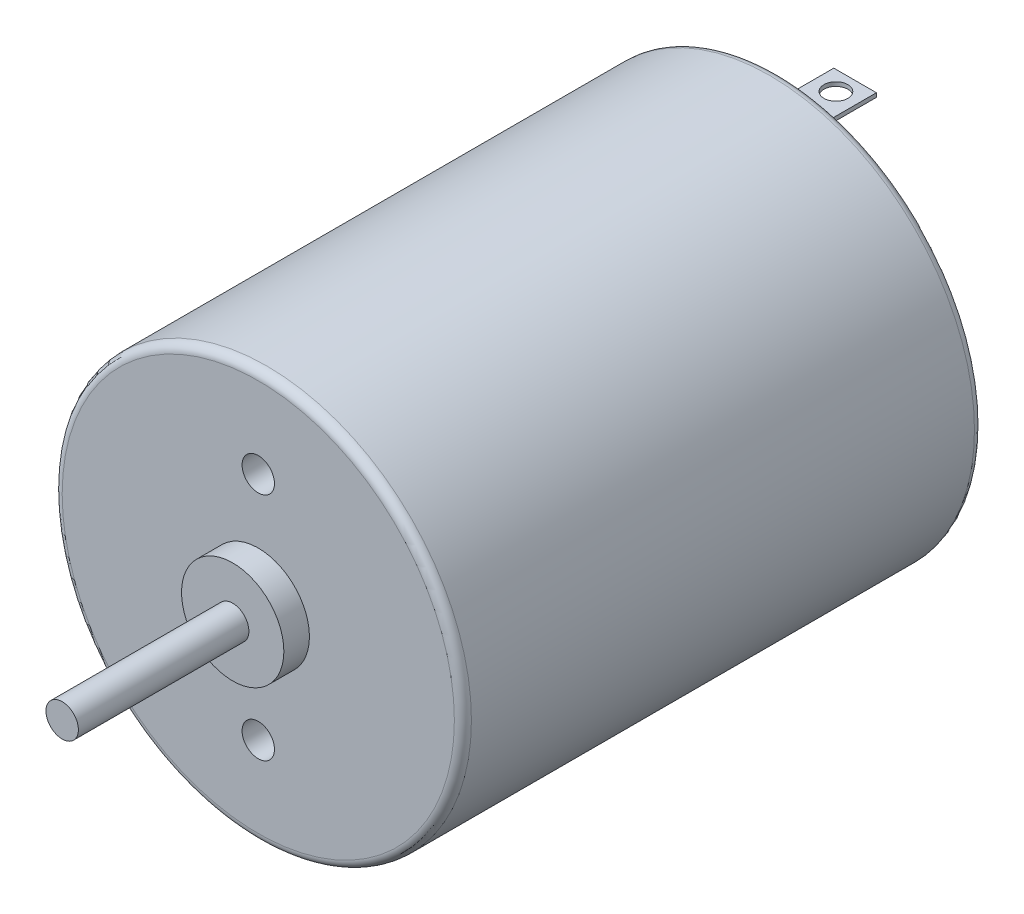
ISO-10303-21;
HEADER;
FILE_DESCRIPTION(('STEP AP214'),'2;1');
FILE_NAME('part.step','',(''),(''),'','','');
FILE_SCHEMA(('AUTOMOTIVE_DESIGN { 1 0 10303 214 1 1 1 1 }'));
ENDSEC;
DATA;
#1=APPLICATION_CONTEXT('core data for automotive mechanical design processes');
#2=APPLICATION_PROTOCOL_DEFINITION('international standard','automotive_design',2000,#1);
#3=PRODUCT_CONTEXT('',#1,'mechanical');
#4=PRODUCT('Part','Part','',(#3));
#5=PRODUCT_RELATED_PRODUCT_CATEGORY('part','',(#4));
#6=PRODUCT_DEFINITION_FORMATION('','',#4);
#7=PRODUCT_DEFINITION_CONTEXT('part definition',#1,'design');
#8=PRODUCT_DEFINITION('design','',#6,#7);
#9=PRODUCT_DEFINITION_SHAPE('','',#8);
#10=(LENGTH_UNIT() NAMED_UNIT(*) SI_UNIT(.MILLI.,.METRE.));
#11=(NAMED_UNIT(*) PLANE_ANGLE_UNIT() SI_UNIT($,.RADIAN.));
#12=(NAMED_UNIT(*) SI_UNIT($,.STERADIAN.) SOLID_ANGLE_UNIT());
#13=UNCERTAINTY_MEASURE_WITH_UNIT(LENGTH_MEASURE(1.E-05),#10,'distance_accuracy_value','');
#14=(GEOMETRIC_REPRESENTATION_CONTEXT(3) GLOBAL_UNCERTAINTY_ASSIGNED_CONTEXT((#13)) GLOBAL_UNIT_ASSIGNED_CONTEXT((#10,
#11,#12)) REPRESENTATION_CONTEXT('',''));
#15=CARTESIAN_POINT('',(0.,0.,0.));
#16=DIRECTION('',(0.,0.,1.));
#17=DIRECTION('',(1.,0.,0.));
#18=AXIS2_PLACEMENT_3D('',#15,#16,#17);
#19=CARTESIAN_POINT('',(0.,0.,30.5));
#20=DIRECTION('',(0.,0.,-1.));
#21=DIRECTION('',(-1.,0.,0.));
#22=AXIS2_PLACEMENT_3D('',#19,#20,#21);
#23=CYLINDRICAL_SURFACE('',#22,12.);
#24=CARTESIAN_POINT('',(0.,0.,0.5));
#25=DIRECTION('',(0.,0.,1.));
#26=DIRECTION('',(1.,0.,0.));
#27=AXIS2_PLACEMENT_3D('',#24,#25,#26);
#28=CIRCLE('',#27,12.);
#29=CARTESIAN_POINT('',(-12.,0.,0.499999999999997));
#30=VERTEX_POINT('',#29);
#31=EDGE_CURVE('E199',#30,#30,#28,.T.);
#32=CARTESIAN_POINT('',(0.,0.,30.));
#33=DIRECTION('',(0.,0.,1.));
#34=DIRECTION('',(1.,0.,0.));
#35=AXIS2_PLACEMENT_3D('',#32,#33,#34);
#36=CIRCLE('',#35,12.);
#37=CARTESIAN_POINT('',(-12.,0.,30.));
#38=VERTEX_POINT('',#37);
#39=EDGE_CURVE('E196',#38,#38,#36,.F.);
#40=CARTESIAN_POINT('',(-12.,0.,0.499999999999997));
#41=CARTESIAN_POINT('',(-12.,0.,0.807291666666663));
#42=CARTESIAN_POINT('',(-12.,0.,1.11458333333333));
#43=CARTESIAN_POINT('',(-12.,0.,1.72916666666666));
#44=CARTESIAN_POINT('',(-12.,0.,2.03645833333333));
#45=CARTESIAN_POINT('',(-12.,0.,2.65104166666666));
#46=CARTESIAN_POINT('',(-12.,0.,2.95833333333333));
#47=CARTESIAN_POINT('',(-12.,0.,3.57291666666666));
#48=CARTESIAN_POINT('',(-12.,0.,3.88020833333333));
#49=CARTESIAN_POINT('',(-12.,0.,4.49479166666666));
#50=CARTESIAN_POINT('',(-12.,0.,4.80208333333333));
#51=CARTESIAN_POINT('',(-12.,0.,5.41666666666666));
#52=CARTESIAN_POINT('',(-12.,0.,5.72395833333333));
#53=CARTESIAN_POINT('',(-12.,0.,6.33854166666667));
#54=CARTESIAN_POINT('',(-12.,0.,6.64583333333333));
#55=CARTESIAN_POINT('',(-12.,0.,7.26041666666666));
#56=CARTESIAN_POINT('',(-12.,0.,7.56770833333333));
#57=CARTESIAN_POINT('',(-12.,0.,8.18229166666666));
#58=CARTESIAN_POINT('',(-12.,0.,8.48958333333333));
#59=CARTESIAN_POINT('',(-12.,0.,9.10416666666666));
#60=CARTESIAN_POINT('',(-12.,0.,9.41145833333333));
#61=CARTESIAN_POINT('',(-12.,0.,10.0260416666667));
#62=CARTESIAN_POINT('',(-12.,0.,10.3333333333333));
#63=CARTESIAN_POINT('',(-12.,0.,10.9479166666667));
#64=CARTESIAN_POINT('',(-12.,0.,11.2552083333333));
#65=CARTESIAN_POINT('',(-12.,0.,11.8697916666667));
#66=CARTESIAN_POINT('',(-12.,0.,12.1770833333333));
#67=CARTESIAN_POINT('',(-12.,0.,12.7916666666667));
#68=CARTESIAN_POINT('',(-12.,0.,13.0989583333333));
#69=CARTESIAN_POINT('',(-12.,0.,13.7135416666667));
#70=CARTESIAN_POINT('',(-12.,0.,14.0208333333333));
#71=CARTESIAN_POINT('',(-12.,0.,14.6354166666667));
#72=CARTESIAN_POINT('',(-12.,0.,14.9427083333333));
#73=CARTESIAN_POINT('',(-12.,0.,15.5572916666667));
#74=CARTESIAN_POINT('',(-12.,0.,15.8645833333333));
#75=CARTESIAN_POINT('',(-12.,0.,16.4791666666667));
#76=CARTESIAN_POINT('',(-12.,0.,16.7864583333333));
#77=CARTESIAN_POINT('',(-12.,0.,17.4010416666667));
#78=CARTESIAN_POINT('',(-12.,0.,17.7083333333333));
#79=CARTESIAN_POINT('',(-12.,0.,18.3229166666667));
#80=CARTESIAN_POINT('',(-12.,0.,18.6302083333333));
#81=CARTESIAN_POINT('',(-12.,0.,19.2447916666667));
#82=CARTESIAN_POINT('',(-12.,0.,19.5520833333333));
#83=CARTESIAN_POINT('',(-12.,0.,20.1666666666667));
#84=CARTESIAN_POINT('',(-12.,0.,20.4739583333333));
#85=CARTESIAN_POINT('',(-12.,0.,21.0885416666667));
#86=CARTESIAN_POINT('',(-12.,0.,21.3958333333333));
#87=CARTESIAN_POINT('',(-12.,0.,22.0104166666667));
#88=CARTESIAN_POINT('',(-12.,0.,22.3177083333333));
#89=CARTESIAN_POINT('',(-12.,0.,22.9322916666667));
#90=CARTESIAN_POINT('',(-12.,0.,23.2395833333333));
#91=CARTESIAN_POINT('',(-12.,0.,23.8541666666667));
#92=CARTESIAN_POINT('',(-12.,0.,24.1614583333333));
#93=CARTESIAN_POINT('',(-12.,0.,24.7760416666667));
#94=CARTESIAN_POINT('',(-12.,0.,25.0833333333333));
#95=CARTESIAN_POINT('',(-12.,0.,25.6979166666667));
#96=CARTESIAN_POINT('',(-12.,0.,26.0052083333333));
#97=CARTESIAN_POINT('',(-12.,0.,26.6197916666667));
#98=CARTESIAN_POINT('',(-12.,0.,26.9270833333333));
#99=CARTESIAN_POINT('',(-12.,0.,27.5416666666667));
#100=CARTESIAN_POINT('',(-12.,0.,27.8489583333333));
#101=CARTESIAN_POINT('',(-12.,0.,28.4635416666667));
#102=CARTESIAN_POINT('',(-12.,0.,28.7708333333333));
#103=CARTESIAN_POINT('',(-12.,0.,29.3854166666667));
#104=CARTESIAN_POINT('',(-12.,0.,29.6927083333333));
#105=CARTESIAN_POINT('',(-12.,0.,30.));
#106=B_SPLINE_CURVE_WITH_KNOTS('',3,(#40,#41,#42,#43,#44,#45,#46,#47,#48,#49,#50,#51,#52,#53,
#54,#55,#56,#57,#58,#59,#60,#61,#62,#63,#64,#65,#66,#67,#68,#69,#70,#71,#72,#73,#74,#75,#76,#77,
#78,#79,#80,#81,#82,#83,#84,#85,#86,#87,#88,#89,#90,#91,#92,#93,#94,#95,#96,#97,#98,#99,#100,
#101,#102,#103,#104,#105),.UNSPECIFIED.,.F.,.F.,(4,2,2,2,2,2,2,2,2,2,2,2,2,2,2,2,2,2,2,2,2,2,2,
2,2,2,2,2,2,2,2,2,4),(0.,0.921874999999999,1.84375,2.765625,3.6875,4.609375,5.53125,6.453125,
7.375,8.296875,9.21875,10.140625,11.0625,11.984375,12.90625,13.828125,14.75,15.671875,16.59375,
17.515625,18.4375,19.359375,20.28125,21.203125,22.125,23.046875,23.96875,24.890625,25.8125,
26.734375,27.65625,28.578125,29.5),.UNSPECIFIED.);
#107=EDGE_CURVE('BSEAM35',#30,#38,#106,.T.);
#108=ORIENTED_EDGE('',*,*,#31,.T.);
#109=ORIENTED_EDGE('',*,*,#39,.T.);
#110=ORIENTED_EDGE('',*,*,#107,.T.);
#111=ORIENTED_EDGE('',*,*,#107,.F.);
#112=EDGE_LOOP('',(#108,#110,#109,#111));
#113=FACE_BOUND('',#112,.T.);
#114=ADVANCED_FACE('F35',(#113),#23,.T.);
#115=CARTESIAN_POINT('',(0.,0.,30.5));
#116=DIRECTION('',(0.,0.,1.));
#117=DIRECTION('',(1.,0.,0.));
#118=AXIS2_PLACEMENT_3D('',#115,#116,#117);
#119=PLANE('',#118);
#120=CARTESIAN_POINT('',(0.,6.75,30.5));
#121=DIRECTION('',(0.,0.,1.));
#122=DIRECTION('',(1.,0.,0.));
#123=AXIS2_PLACEMENT_3D('',#120,#121,#122);
#124=CIRCLE('',#123,0.95);
#125=CARTESIAN_POINT('',(0.95,6.75,30.5));
#126=VERTEX_POINT('',#125);
#127=EDGE_CURVE('E641',#126,#126,#124,.T.);
#128=ORIENTED_EDGE('',*,*,#127,.F.);
#129=EDGE_LOOP('',(#128));
#130=FACE_BOUND('',#129,.T.);
#131=CARTESIAN_POINT('',(0.,-6.75,30.5));
#132=DIRECTION('',(0.,0.,1.));
#133=DIRECTION('',(1.,0.,0.));
#134=AXIS2_PLACEMENT_3D('',#131,#132,#133);
#135=CIRCLE('',#134,0.95);
#136=CARTESIAN_POINT('',(0.95,-6.75,30.5));
#137=VERTEX_POINT('',#136);
#138=EDGE_CURVE('E649',#137,#137,#135,.T.);
#139=ORIENTED_EDGE('',*,*,#138,.F.);
#140=EDGE_LOOP('',(#139));
#141=FACE_BOUND('',#140,.T.);
#142=CARTESIAN_POINT('',(0.,0.,30.5));
#143=DIRECTION('',(0.,0.,1.));
#144=DIRECTION('',(1.,0.,0.));
#145=AXIS2_PLACEMENT_3D('',#142,#143,#144);
#146=CIRCLE('',#145,11.5);
#147=CARTESIAN_POINT('',(11.5,0.,30.5));
#148=VERTEX_POINT('',#147);
#149=EDGE_CURVE('E193',#148,#148,#146,.T.);
#150=ORIENTED_EDGE('',*,*,#149,.T.);
#151=EDGE_LOOP('',(#150));
#152=FACE_BOUND('',#151,.T.);
#153=CARTESIAN_POINT('',(0.,0.,30.5));
#154=DIRECTION('',(0.,0.,1.));
#155=DIRECTION('',(1.,0.,0.));
#156=AXIS2_PLACEMENT_3D('',#153,#154,#155);
#157=CIRCLE('',#156,3.);
#158=CARTESIAN_POINT('',(3.,0.,30.5));
#159=VERTEX_POINT('',#158);
#160=EDGE_CURVE('E182',#159,#159,#157,.T.);
#161=ORIENTED_EDGE('',*,*,#160,.F.);
#162=EDGE_LOOP('',(#161));
#163=FACE_BOUND('',#162,.T.);
#164=ADVANCED_FACE('F294',(#130,#141,#152,#163),#119,.T.);
#165=CARTESIAN_POINT('',(0.,0.,0.));
#166=DIRECTION('',(0.,0.,1.));
#167=DIRECTION('',(1.,0.,0.));
#168=AXIS2_PLACEMENT_3D('',#165,#166,#167);
#169=PLANE('',#168);
#170=CARTESIAN_POINT('',(0.,0.,0.));
#171=DIRECTION('',(0.,0.,1.));
#172=DIRECTION('',(1.,0.,0.));
#173=AXIS2_PLACEMENT_3D('',#170,#171,#172);
#174=CIRCLE('',#173,11.5);
#175=CARTESIAN_POINT('',(11.5,0.,0.));
#176=VERTEX_POINT('',#175);
#177=EDGE_CURVE('E223',#176,#176,#174,.F.);
#178=ORIENTED_EDGE('',*,*,#177,.T.);
#179=EDGE_LOOP('',(#178));
#180=FACE_BOUND('',#179,.T.);
#181=CARTESIAN_POINT('',(0.,0.,0.));
#182=DIRECTION('',(0.,0.,1.));
#183=DIRECTION('',(1.,0.,0.));
#184=AXIS2_PLACEMENT_3D('',#181,#182,#183);
#185=CIRCLE('',#184,5.);
#186=CARTESIAN_POINT('',(5.,0.,0.));
#187=VERTEX_POINT('',#186);
#188=EDGE_CURVE('E220',#187,#187,#185,.T.);
#189=ORIENTED_EDGE('',*,*,#188,.T.);
#190=EDGE_LOOP('',(#189));
#191=FACE_BOUND('',#190,.T.);
#192=DIRECTION('',(-1.,0.,0.));
#193=VECTOR('',#192,1.);
#194=CARTESIAN_POINT('',(0.,-8.51284741519959,0.));
#195=LINE('',#194,#193);
#196=CARTESIAN_POINT('',(1.75,-8.51284741519959,0.));
#197=VERTEX_POINT('',#196);
#198=CARTESIAN_POINT('',(-1.75,-8.5128474151996,0.));
#199=VERTEX_POINT('',#198);
#200=EDGE_CURVE('E215',#197,#199,#195,.T.);
#201=ORIENTED_EDGE('',*,*,#200,.T.);
#202=DIRECTION('',(0.,1.,0.));
#203=VECTOR('',#202,1.);
#204=CARTESIAN_POINT('',(-1.75,-9.25,0.));
#205=LINE('',#204,#203);
#206=CARTESIAN_POINT('',(-1.75,-9.75,0.));
#207=VERTEX_POINT('',#206);
#208=EDGE_CURVE('E217',#199,#207,#205,.F.);
#209=ORIENTED_EDGE('',*,*,#208,.T.);
#210=DIRECTION('',(1.,0.,0.));
#211=VECTOR('',#210,1.);
#212=CARTESIAN_POINT('',(0.,-9.75,0.));
#213=LINE('',#212,#211);
#214=CARTESIAN_POINT('',(1.75,-9.75,0.));
#215=VERTEX_POINT('',#214);
#216=EDGE_CURVE('E211',#207,#215,#213,.T.);
#217=ORIENTED_EDGE('',*,*,#216,.T.);
#218=DIRECTION('',(0.,1.,0.));
#219=VECTOR('',#218,1.);
#220=CARTESIAN_POINT('',(1.74999999999999,0.,0.));
#221=LINE('',#220,#219);
#222=EDGE_CURVE('E213',#215,#197,#221,.T.);
#223=ORIENTED_EDGE('',*,*,#222,.T.);
#224=EDGE_LOOP('',(#201,#209,#217,#223));
#225=FACE_BOUND('',#224,.T.);
#226=DIRECTION('',(-1.,0.,0.));
#227=VECTOR('',#226,1.);
#228=CARTESIAN_POINT('',(1.25,8.51284741519959,0.));
#229=LINE('',#228,#227);
#230=CARTESIAN_POINT('',(-1.75,8.5128474151996,0.));
#231=VERTEX_POINT('',#230);
#232=CARTESIAN_POINT('',(1.75,8.51284741519959,0.));
#233=VERTEX_POINT('',#232);
#234=EDGE_CURVE('E206',#231,#233,#229,.F.);
#235=ORIENTED_EDGE('',*,*,#234,.T.);
#236=DIRECTION('',(0.,-1.,0.));
#237=VECTOR('',#236,1.);
#238=CARTESIAN_POINT('',(1.75,9.25,0.));
#239=LINE('',#238,#237);
#240=CARTESIAN_POINT('',(1.75,9.75,0.));
#241=VERTEX_POINT('',#240);
#242=EDGE_CURVE('E208',#233,#241,#239,.F.);
#243=ORIENTED_EDGE('',*,*,#242,.T.);
#244=DIRECTION('',(-1.,0.,0.));
#245=VECTOR('',#244,1.);
#246=CARTESIAN_POINT('',(0.,9.75,0.));
#247=LINE('',#246,#245);
#248=CARTESIAN_POINT('',(-1.75,9.75,0.));
#249=VERTEX_POINT('',#248);
#250=EDGE_CURVE('E202',#241,#249,#247,.T.);
#251=ORIENTED_EDGE('',*,*,#250,.T.);
#252=DIRECTION('',(0.,-1.,0.));
#253=VECTOR('',#252,1.);
#254=CARTESIAN_POINT('',(-1.75,0.,0.));
#255=LINE('',#254,#253);
#256=EDGE_CURVE('E204',#249,#231,#255,.T.);
#257=ORIENTED_EDGE('',*,*,#256,.T.);
#258=EDGE_LOOP('',(#235,#243,#251,#257));
#259=FACE_BOUND('',#258,.T.);
#260=ADVANCED_FACE('F272',(#180,#191,#225,#259),#169,.F.);
#261=CARTESIAN_POINT('',(0.,0.,-2.));
#262=DIRECTION('',(0.,0.,1.));
#263=DIRECTION('',(1.,0.,0.));
#264=AXIS2_PLACEMENT_3D('',#261,#262,#263);
#265=CYLINDRICAL_SURFACE('',#264,4.5);
#266=CARTESIAN_POINT('',(0.,0.,-0.5));
#267=DIRECTION('',(0.,0.,1.));
#268=DIRECTION('',(1.,0.,0.));
#269=AXIS2_PLACEMENT_3D('',#266,#267,#268);
#270=CIRCLE('',#269,4.5);
#271=CARTESIAN_POINT('',(4.5,0.,-0.5));
#272=VERTEX_POINT('',#271);
#273=EDGE_CURVE('E226',#272,#272,#270,.F.);
#274=ORIENTED_EDGE('',*,*,#273,.T.);
#275=EDGE_LOOP('',(#274));
#276=FACE_BOUND('',#275,.T.);
#277=CARTESIAN_POINT('',(0.,0.,-2.));
#278=DIRECTION('',(0.,0.,-1.));
#279=DIRECTION('',(-1.,0.,0.));
#280=AXIS2_PLACEMENT_3D('',#277,#278,#279);
#281=CIRCLE('',#280,4.5);
#282=CARTESIAN_POINT('',(-4.5,0.,-2.));
#283=VERTEX_POINT('',#282);
#284=EDGE_CURVE('E181',#283,#283,#281,.T.);
#285=ORIENTED_EDGE('',*,*,#284,.F.);
#286=EDGE_LOOP('',(#285));
#287=FACE_BOUND('',#286,.T.);
#288=ADVANCED_FACE('F539',(#276,#287),#265,.T.);
#289=CARTESIAN_POINT('',(0.,0.,-2.));
#290=DIRECTION('',(0.,0.,-1.));
#291=DIRECTION('',(-1.,0.,0.));
#292=AXIS2_PLACEMENT_3D('',#289,#290,#291);
#293=PLANE('',#292);
#294=CARTESIAN_POINT('',(0.,0.,-2.));
#295=DIRECTION('',(0.,0.,-1.));
#296=DIRECTION('',(-1.,0.,0.));
#297=AXIS2_PLACEMENT_3D('',#294,#295,#296);
#298=CIRCLE('',#297,0.95);
#299=CARTESIAN_POINT('',(-0.95,0.,-2.));
#300=VERTEX_POINT('',#299);
#301=EDGE_CURVE('E253',#300,#300,#298,.T.);
#302=ORIENTED_EDGE('',*,*,#301,.F.);
#303=EDGE_LOOP('',(#302));
#304=FACE_BOUND('',#303,.T.);
#305=ORIENTED_EDGE('',*,*,#284,.T.);
#306=EDGE_LOOP('',(#305));
#307=FACE_BOUND('',#306,.T.);
#308=ADVANCED_FACE('F450',(#304,#307),#293,.T.);
#309=CARTESIAN_POINT('',(0.,0.,32.));
#310=DIRECTION('',(0.,0.,-1.));
#311=DIRECTION('',(-1.,0.,0.));
#312=AXIS2_PLACEMENT_3D('',#309,#310,#311);
#313=CYLINDRICAL_SURFACE('',#312,3.);
#314=CARTESIAN_POINT('',(0.,0.,32.));
#315=DIRECTION('',(0.,0.,1.));
#316=DIRECTION('',(1.,0.,0.));
#317=AXIS2_PLACEMENT_3D('',#314,#315,#316);
#318=CIRCLE('',#317,3.);
#319=CARTESIAN_POINT('',(3.,0.,32.));
#320=VERTEX_POINT('',#319);
#321=EDGE_CURVE('E178',#320,#320,#318,.T.);
#322=ORIENTED_EDGE('',*,*,#321,.F.);
#323=EDGE_LOOP('',(#322));
#324=FACE_BOUND('',#323,.T.);
#325=ORIENTED_EDGE('',*,*,#160,.T.);
#326=EDGE_LOOP('',(#325));
#327=FACE_BOUND('',#326,.T.);
#328=ADVANCED_FACE('F445',(#324,#327),#313,.T.);
#329=CARTESIAN_POINT('',(0.,0.,32.));
#330=DIRECTION('',(0.,0.,1.));
#331=DIRECTION('',(1.,0.,0.));
#332=AXIS2_PLACEMENT_3D('',#329,#330,#331);
#333=PLANE('',#332);
#334=CARTESIAN_POINT('',(0.,0.,32.));
#335=DIRECTION('',(0.,0.,1.));
#336=DIRECTION('',(1.,0.,0.));
#337=AXIS2_PLACEMENT_3D('',#334,#335,#336);
#338=CIRCLE('',#337,0.95);
#339=CARTESIAN_POINT('',(0.95,0.,32.));
#340=VERTEX_POINT('',#339);
#341=EDGE_CURVE('E185',#340,#340,#338,.T.);
#342=ORIENTED_EDGE('',*,*,#341,.F.);
#343=EDGE_LOOP('',(#342));
#344=FACE_BOUND('',#343,.T.);
#345=ORIENTED_EDGE('',*,*,#321,.T.);
#346=EDGE_LOOP('',(#345));
#347=FACE_BOUND('',#346,.T.);
#348=ADVANCED_FACE('F449',(#344,#347),#333,.T.);
#349=CARTESIAN_POINT('',(1.24999999999999,0.,-4.5));
#350=DIRECTION('',(1.,0.,0.));
#351=DIRECTION('',(0.,1.,0.));
#352=AXIS2_PLACEMENT_3D('',#349,#350,#351);
#353=PLANE('',#352);
#354=DIRECTION('',(0.,0.,1.));
#355=VECTOR('',#354,1.);
#356=CARTESIAN_POINT('',(1.25,-9.01284741519959,-4.5));
#357=LINE('',#356,#355);
#358=CARTESIAN_POINT('',(1.25,-9.01284741519959,-4.5));
#359=VERTEX_POINT('',#358);
#360=CARTESIAN_POINT('',(1.25,-9.01284741519959,-0.5));
#361=VERTEX_POINT('',#360);
#362=EDGE_CURVE('E166',#359,#361,#357,.T.);
#363=ORIENTED_EDGE('',*,*,#362,.T.);
#364=DIRECTION('',(0.,1.,0.));
#365=VECTOR('',#364,1.);
#366=CARTESIAN_POINT('',(1.24999999999999,0.,-0.5));
#367=LINE('',#366,#365);
#368=CARTESIAN_POINT('',(1.25,-9.25,-0.5));
#369=VERTEX_POINT('',#368);
#370=EDGE_CURVE('E234',#361,#369,#367,.F.);
#371=ORIENTED_EDGE('',*,*,#370,.T.);
#372=DIRECTION('',(0.,0.,1.));
#373=VECTOR('',#372,1.);
#374=CARTESIAN_POINT('',(1.25,-9.25,-4.5));
#375=LINE('',#374,#373);
#376=CARTESIAN_POINT('',(1.25,-9.25,-4.5));
#377=VERTEX_POINT('',#376);
#378=EDGE_CURVE('E175',#377,#369,#375,.T.);
#379=ORIENTED_EDGE('',*,*,#378,.F.);
#380=DIRECTION('',(0.,1.,0.));
#381=VECTOR('',#380,1.);
#382=CARTESIAN_POINT('',(1.24999999999999,0.,-4.5));
#383=LINE('',#382,#381);
#384=EDGE_CURVE('E131',#377,#359,#383,.T.);
#385=ORIENTED_EDGE('',*,*,#384,.T.);
#386=EDGE_LOOP('',(#363,#371,#379,#385));
#387=FACE_BOUND('',#386,.T.);
#388=ADVANCED_FACE('F464',(#387),#353,.T.);
#389=CARTESIAN_POINT('',(0.,-9.25,-4.5));
#390=DIRECTION('',(0.,-1.,0.));
#391=DIRECTION('',(0.,0.,-1.));
#392=AXIS2_PLACEMENT_3D('',#389,#390,#391);
#393=PLANE('',#392);
#394=CARTESIAN_POINT('',(0.,-9.25,-3.375));
#395=DIRECTION('',(0.,-1.,0.));
#396=DIRECTION('',(0.,0.,-1.));
#397=AXIS2_PLACEMENT_3D('',#394,#395,#396);
#398=CIRCLE('',#397,0.7);
#399=CARTESIAN_POINT('',(0.,-9.25,-4.075));
#400=VERTEX_POINT('',#399);
#401=EDGE_CURVE('E140',#400,#400,#398,.T.);
#402=ORIENTED_EDGE('',*,*,#401,.F.);
#403=EDGE_LOOP('',(#402));
#404=FACE_BOUND('',#403,.T.);
#405=ORIENTED_EDGE('',*,*,#378,.T.);
#406=DIRECTION('',(1.,0.,0.));
#407=VECTOR('',#406,1.);
#408=CARTESIAN_POINT('',(0.,-9.25,-0.5));
#409=LINE('',#408,#407);
#410=CARTESIAN_POINT('',(-1.25,-9.25,-0.5));
#411=VERTEX_POINT('',#410);
#412=EDGE_CURVE('E236',#369,#411,#409,.F.);
#413=ORIENTED_EDGE('',*,*,#412,.T.);
#414=DIRECTION('',(0.,0.,1.));
#415=VECTOR('',#414,1.);
#416=CARTESIAN_POINT('',(-1.25,-9.25,-4.5));
#417=LINE('',#416,#415);
#418=CARTESIAN_POINT('',(-1.25,-9.25,-4.5));
#419=VERTEX_POINT('',#418);
#420=EDGE_CURVE('E172',#419,#411,#417,.T.);
#421=ORIENTED_EDGE('',*,*,#420,.F.);
#422=DIRECTION('',(1.,0.,0.));
#423=VECTOR('',#422,1.);
#424=CARTESIAN_POINT('',(0.,-9.25,-4.5));
#425=LINE('',#424,#423);
#426=EDGE_CURVE('E158',#419,#377,#425,.T.);
#427=ORIENTED_EDGE('',*,*,#426,.T.);
#428=EDGE_LOOP('',(#405,#413,#421,#427));
#429=FACE_BOUND('',#428,.T.);
#430=ADVANCED_FACE('F471',(#404,#429),#393,.T.);
#431=CARTESIAN_POINT('',(-1.25,0.,-4.5));
#432=DIRECTION('',(1.,0.,0.));
#433=DIRECTION('',(0.,0.,-1.));
#434=AXIS2_PLACEMENT_3D('',#431,#432,#433);
#435=PLANE('',#434);
#436=ORIENTED_EDGE('',*,*,#420,.T.);
#437=DIRECTION('',(0.,1.,0.));
#438=VECTOR('',#437,1.);
#439=CARTESIAN_POINT('',(-1.25,-9.0128474151996,-0.5));
#440=LINE('',#439,#438);
#441=CARTESIAN_POINT('',(-1.25,-9.0128474151996,-0.5));
#442=VERTEX_POINT('',#441);
#443=EDGE_CURVE('E229',#411,#442,#440,.T.);
#444=ORIENTED_EDGE('',*,*,#443,.T.);
#445=DIRECTION('',(0.,0.,1.));
#446=VECTOR('',#445,1.);
#447=CARTESIAN_POINT('',(-1.25,-9.0128474151996,-4.5));
#448=LINE('',#447,#446);
#449=CARTESIAN_POINT('',(-1.25,-9.0128474151996,-4.5));
#450=VERTEX_POINT('',#449);
#451=EDGE_CURVE('E169',#450,#442,#448,.T.);
#452=ORIENTED_EDGE('',*,*,#451,.F.);
#453=DIRECTION('',(0.,1.,0.));
#454=VECTOR('',#453,1.);
#455=CARTESIAN_POINT('',(-1.25,0.,-4.5));
#456=LINE('',#455,#454);
#457=EDGE_CURVE('E161',#419,#450,#456,.T.);
#458=ORIENTED_EDGE('',*,*,#457,.F.);
#459=EDGE_LOOP('',(#436,#444,#452,#458));
#460=FACE_BOUND('',#459,.T.);
#461=ADVANCED_FACE('F480',(#460),#435,.F.);
#462=CARTESIAN_POINT('',(0.,-9.01284741519959,-4.5));
#463=DIRECTION('',(0.,1.,0.));
#464=DIRECTION('',(-1.,0.,0.));
#465=AXIS2_PLACEMENT_3D('',#462,#463,#464);
#466=PLANE('',#465);
#467=CARTESIAN_POINT('',(0.,-9.01284741519959,-3.375));
#468=DIRECTION('',(0.,1.,0.));
#469=DIRECTION('',(-1.,0.,0.));
#470=AXIS2_PLACEMENT_3D('',#467,#468,#469);
#471=CIRCLE('',#470,0.7);
#472=CARTESIAN_POINT('',(-0.700000000000025,-9.01284741519959,-3.375));
#473=VERTEX_POINT('',#472);
#474=EDGE_CURVE('E191',#473,#473,#471,.T.);
#475=ORIENTED_EDGE('',*,*,#474,.F.);
#476=EDGE_LOOP('',(#475));
#477=FACE_BOUND('',#476,.T.);
#478=ORIENTED_EDGE('',*,*,#451,.T.);
#479=DIRECTION('',(-1.,0.,0.));
#480=VECTOR('',#479,1.);
#481=CARTESIAN_POINT('',(0.,-9.01284741519959,-0.5));
#482=LINE('',#481,#480);
#483=EDGE_CURVE('E232',#442,#361,#482,.F.);
#484=ORIENTED_EDGE('',*,*,#483,.T.);
#485=ORIENTED_EDGE('',*,*,#362,.F.);
#486=DIRECTION('',(-1.,0.,0.));
#487=VECTOR('',#486,1.);
#488=CARTESIAN_POINT('',(0.,-9.01284741519959,-4.5));
#489=LINE('',#488,#487);
#490=EDGE_CURVE('E163',#359,#450,#489,.T.);
#491=ORIENTED_EDGE('',*,*,#490,.T.);
#492=EDGE_LOOP('',(#478,#484,#485,#491));
#493=FACE_BOUND('',#492,.T.);
#494=ADVANCED_FACE('F435',(#477,#493),#466,.T.);
#495=CARTESIAN_POINT('',(0.,0.,-4.5));
#496=DIRECTION('',(0.,0.,-1.));
#497=DIRECTION('',(-1.,0.,0.));
#498=AXIS2_PLACEMENT_3D('',#495,#496,#497);
#499=PLANE('',#498);
#500=ORIENTED_EDGE('',*,*,#384,.F.);
#501=ORIENTED_EDGE('',*,*,#426,.F.);
#502=ORIENTED_EDGE('',*,*,#457,.T.);
#503=ORIENTED_EDGE('',*,*,#490,.F.);
#504=EDGE_LOOP('',(#500,#501,#502,#503));
#505=FACE_BOUND('',#504,.T.);
#506=ADVANCED_FACE('F430',(#505),#499,.T.);
#507=CARTESIAN_POINT('',(-1.25,0.,-4.5));
#508=DIRECTION('',(-1.,0.,0.));
#509=DIRECTION('',(0.,0.,1.));
#510=AXIS2_PLACEMENT_3D('',#507,#508,#509);
#511=PLANE('',#510);
#512=DIRECTION('',(0.,0.,1.));
#513=VECTOR('',#512,1.);
#514=CARTESIAN_POINT('',(-1.25,9.0128474151996,-4.5));
#515=LINE('',#514,#513);
#516=CARTESIAN_POINT('',(-1.25,9.0128474151996,-4.5));
#517=VERTEX_POINT('',#516);
#518=CARTESIAN_POINT('',(-1.25,9.0128474151996,-0.5));
#519=VERTEX_POINT('',#518);
#520=EDGE_CURVE('E151',#517,#519,#515,.T.);
#521=ORIENTED_EDGE('',*,*,#520,.T.);
#522=DIRECTION('',(0.,-1.,0.));
#523=VECTOR('',#522,1.);
#524=CARTESIAN_POINT('',(-1.25,0.,-0.5));
#525=LINE('',#524,#523);
#526=CARTESIAN_POINT('',(-1.25,9.25,-0.5));
#527=VERTEX_POINT('',#526);
#528=EDGE_CURVE('E44',#519,#527,#525,.F.);
#529=ORIENTED_EDGE('',*,*,#528,.T.);
#530=DIRECTION('',(0.,0.,1.));
#531=VECTOR('',#530,1.);
#532=CARTESIAN_POINT('',(-1.25,9.25,-4.5));
#533=LINE('',#532,#531);
#534=CARTESIAN_POINT('',(-1.25,9.25,-4.5));
#535=VERTEX_POINT('',#534);
#536=EDGE_CURVE('E124',#535,#527,#533,.T.);
#537=ORIENTED_EDGE('',*,*,#536,.F.);
#538=DIRECTION('',(0.,-1.,0.));
#539=VECTOR('',#538,1.);
#540=CARTESIAN_POINT('',(-1.25,0.,-4.5));
#541=LINE('',#540,#539);
#542=EDGE_CURVE('E127',#535,#517,#541,.T.);
#543=ORIENTED_EDGE('',*,*,#542,.T.);
#544=EDGE_LOOP('',(#521,#529,#537,#543));
#545=FACE_BOUND('',#544,.T.);
#546=ADVANCED_FACE('F126',(#545),#511,.T.);
#547=CARTESIAN_POINT('',(0.,9.25,-4.5));
#548=DIRECTION('',(0.,1.,0.));
#549=DIRECTION('',(-1.,0.,0.));
#550=AXIS2_PLACEMENT_3D('',#547,#548,#549);
#551=PLANE('',#550);
#552=CARTESIAN_POINT('',(0.,9.25,-3.375));
#553=DIRECTION('',(0.,1.,0.));
#554=DIRECTION('',(-1.,0.,0.));
#555=AXIS2_PLACEMENT_3D('',#552,#553,#554);
#556=CIRCLE('',#555,0.7);
#557=CARTESIAN_POINT('',(-0.7,9.25,-3.375));
#558=VERTEX_POINT('',#557);
#559=EDGE_CURVE('E192',#558,#558,#556,.T.);
#560=ORIENTED_EDGE('',*,*,#559,.F.);
#561=EDGE_LOOP('',(#560));
#562=FACE_BOUND('',#561,.T.);
#563=ORIENTED_EDGE('',*,*,#536,.T.);
#564=DIRECTION('',(-1.,0.,0.));
#565=VECTOR('',#564,1.);
#566=CARTESIAN_POINT('',(0.,9.25,-0.5));
#567=LINE('',#566,#565);
#568=CARTESIAN_POINT('',(1.25,9.25,-0.5));
#569=VERTEX_POINT('',#568);
#570=EDGE_CURVE('E12',#527,#569,#567,.F.);
#571=ORIENTED_EDGE('',*,*,#570,.T.);
#572=DIRECTION('',(0.,0.,1.));
#573=VECTOR('',#572,1.);
#574=CARTESIAN_POINT('',(1.25,9.25,-4.5));
#575=LINE('',#574,#573);
#576=CARTESIAN_POINT('',(1.25,9.25,-4.5));
#577=VERTEX_POINT('',#576);
#578=EDGE_CURVE('E132',#577,#569,#575,.T.);
#579=ORIENTED_EDGE('',*,*,#578,.F.);
#580=DIRECTION('',(-1.,0.,0.));
#581=VECTOR('',#580,1.);
#582=CARTESIAN_POINT('',(0.,9.25,-4.5));
#583=LINE('',#582,#581);
#584=EDGE_CURVE('E137',#577,#535,#583,.T.);
#585=ORIENTED_EDGE('',*,*,#584,.T.);
#586=EDGE_LOOP('',(#563,#571,#579,#585));
#587=FACE_BOUND('',#586,.T.);
#588=ADVANCED_FACE('F142',(#562,#587),#551,.T.);
#589=CARTESIAN_POINT('',(1.24999999999999,0.,-4.5));
#590=DIRECTION('',(-1.,0.,0.));
#591=DIRECTION('',(0.,-1.,0.));
#592=AXIS2_PLACEMENT_3D('',#589,#590,#591);
#593=PLANE('',#592);
#594=ORIENTED_EDGE('',*,*,#578,.T.);
#595=DIRECTION('',(0.,-1.,0.));
#596=VECTOR('',#595,1.);
#597=CARTESIAN_POINT('',(1.25,9.01284741519959,-0.5));
#598=LINE('',#597,#596);
#599=CARTESIAN_POINT('',(1.25,9.01284741519959,-0.5));
#600=VERTEX_POINT('',#599);
#601=EDGE_CURVE('E238',#569,#600,#598,.T.);
#602=ORIENTED_EDGE('',*,*,#601,.T.);
#603=DIRECTION('',(0.,0.,1.));
#604=VECTOR('',#603,1.);
#605=CARTESIAN_POINT('',(1.25,9.01284741519959,-4.5));
#606=LINE('',#605,#604);
#607=CARTESIAN_POINT('',(1.25,9.01284741519959,-4.5));
#608=VERTEX_POINT('',#607);
#609=EDGE_CURVE('E153',#608,#600,#606,.T.);
#610=ORIENTED_EDGE('',*,*,#609,.F.);
#611=DIRECTION('',(0.,-1.,0.));
#612=VECTOR('',#611,1.);
#613=CARTESIAN_POINT('',(1.24999999999999,0.,-4.5));
#614=LINE('',#613,#612);
#615=EDGE_CURVE('E145',#577,#608,#614,.T.);
#616=ORIENTED_EDGE('',*,*,#615,.F.);
#617=EDGE_LOOP('',(#594,#602,#610,#616));
#618=FACE_BOUND('',#617,.T.);
#619=ADVANCED_FACE('F281',(#618),#593,.F.);
#620=CARTESIAN_POINT('',(0.,9.01284741519959,-4.5));
#621=DIRECTION('',(0.,1.,0.));
#622=DIRECTION('',(-1.,0.,0.));
#623=AXIS2_PLACEMENT_3D('',#620,#621,#622);
#624=PLANE('',#623);
#625=CARTESIAN_POINT('',(0.,9.01284741519959,-3.375));
#626=DIRECTION('',(0.,1.,0.));
#627=DIRECTION('',(-1.,0.,0.));
#628=AXIS2_PLACEMENT_3D('',#625,#626,#627);
#629=CIRCLE('',#628,0.7);
#630=CARTESIAN_POINT('',(-0.7,9.0128474151996,-3.375));
#631=VERTEX_POINT('',#630);
#632=EDGE_CURVE('E188',#631,#631,#629,.T.);
#633=ORIENTED_EDGE('',*,*,#632,.T.);
#634=EDGE_LOOP('',(#633));
#635=FACE_BOUND('',#634,.T.);
#636=ORIENTED_EDGE('',*,*,#609,.T.);
#637=DIRECTION('',(-1.,0.,0.));
#638=VECTOR('',#637,1.);
#639=CARTESIAN_POINT('',(-1.25,9.0128474151996,-0.5));
#640=LINE('',#639,#638);
#641=EDGE_CURVE('E59',#600,#519,#640,.T.);
#642=ORIENTED_EDGE('',*,*,#641,.T.);
#643=ORIENTED_EDGE('',*,*,#520,.F.);
#644=DIRECTION('',(-1.,0.,0.));
#645=VECTOR('',#644,1.);
#646=CARTESIAN_POINT('',(0.,9.01284741519959,-4.5));
#647=LINE('',#646,#645);
#648=EDGE_CURVE('E139',#608,#517,#647,.T.);
#649=ORIENTED_EDGE('',*,*,#648,.F.);
#650=EDGE_LOOP('',(#636,#642,#643,#649));
#651=FACE_BOUND('',#650,.T.);
#652=ADVANCED_FACE('F282',(#635,#651),#624,.F.);
#653=CARTESIAN_POINT('',(0.,0.,-4.5));
#654=DIRECTION('',(0.,0.,-1.));
#655=DIRECTION('',(-1.,0.,0.));
#656=AXIS2_PLACEMENT_3D('',#653,#654,#655);
#657=PLANE('',#656);
#658=ORIENTED_EDGE('',*,*,#542,.F.);
#659=ORIENTED_EDGE('',*,*,#584,.F.);
#660=ORIENTED_EDGE('',*,*,#615,.T.);
#661=ORIENTED_EDGE('',*,*,#648,.T.);
#662=EDGE_LOOP('',(#658,#659,#660,#661));
#663=FACE_BOUND('',#662,.T.);
#664=ADVANCED_FACE('F136',(#663),#657,.T.);
#665=CARTESIAN_POINT('',(0.,-20.25,-3.375));
#666=DIRECTION('',(0.,1.,0.));
#667=DIRECTION('',(-1.,0.,0.));
#668=AXIS2_PLACEMENT_3D('',#665,#666,#667);
#669=CYLINDRICAL_SURFACE('',#668,0.7);
#670=ORIENTED_EDGE('',*,*,#559,.T.);
#671=EDGE_LOOP('',(#670));
#672=FACE_BOUND('',#671,.T.);
#673=ORIENTED_EDGE('',*,*,#632,.F.);
#674=EDGE_LOOP('',(#673));
#675=FACE_BOUND('',#674,.T.);
#676=ADVANCED_FACE('F290',(#672,#675),#669,.F.);
#677=ORIENTED_EDGE('',*,*,#401,.T.);
#678=EDGE_LOOP('',(#677));
#679=FACE_BOUND('',#678,.T.);
#680=ORIENTED_EDGE('',*,*,#474,.T.);
#681=EDGE_LOOP('',(#680));
#682=FACE_BOUND('',#681,.T.);
#683=ADVANCED_FACE('F404',(#679,#682),#669,.F.);
#684=CARTESIAN_POINT('',(0.,0.,42.));
#685=DIRECTION('',(0.,0.,-1.));
#686=DIRECTION('',(-1.,0.,0.));
#687=AXIS2_PLACEMENT_3D('',#684,#685,#686);
#688=CYLINDRICAL_SURFACE('',#687,0.95);
#689=CARTESIAN_POINT('',(0.,0.,42.));
#690=DIRECTION('',(0.,0.,1.));
#691=DIRECTION('',(1.,0.,0.));
#692=AXIS2_PLACEMENT_3D('',#689,#690,#691);
#693=CIRCLE('',#692,0.95);
#694=CARTESIAN_POINT('',(0.95,0.,42.));
#695=VERTEX_POINT('',#694);
#696=EDGE_CURVE('E655',#695,#695,#693,.T.);
#697=ORIENTED_EDGE('',*,*,#696,.F.);
#698=EDGE_LOOP('',(#697));
#699=FACE_BOUND('',#698,.T.);
#700=ORIENTED_EDGE('',*,*,#341,.T.);
#701=EDGE_LOOP('',(#700));
#702=FACE_BOUND('',#701,.T.);
#703=ADVANCED_FACE('F396',(#699,#702),#688,.T.);
#704=CARTESIAN_POINT('',(0.,0.,42.));
#705=DIRECTION('',(0.,0.,1.));
#706=DIRECTION('',(1.,0.,0.));
#707=AXIS2_PLACEMENT_3D('',#704,#705,#706);
#708=PLANE('',#707);
#709=ORIENTED_EDGE('',*,*,#696,.T.);
#710=EDGE_LOOP('',(#709));
#711=FACE_BOUND('',#710,.T.);
#712=ADVANCED_FACE('F387',(#711),#708,.T.);
#713=CARTESIAN_POINT('',(0.,0.,-1.8));
#714=DIRECTION('',(0.,0.,-1.));
#715=DIRECTION('',(-1.,0.,0.));
#716=AXIS2_PLACEMENT_3D('',#713,#714,#715);
#717=CYLINDRICAL_SURFACE('',#716,0.95);
#718=CARTESIAN_POINT('',(0.,0.,-1.8));
#719=DIRECTION('',(0.,0.,-1.));
#720=DIRECTION('',(-1.,0.,0.));
#721=AXIS2_PLACEMENT_3D('',#718,#719,#720);
#722=CIRCLE('',#721,0.95);
#723=CARTESIAN_POINT('',(-0.95,0.,-1.8));
#724=VERTEX_POINT('',#723);
#725=EDGE_CURVE('E652',#724,#724,#722,.T.);
#726=ORIENTED_EDGE('',*,*,#725,.F.);
#727=EDGE_LOOP('',(#726));
#728=FACE_BOUND('',#727,.T.);
#729=ORIENTED_EDGE('',*,*,#301,.T.);
#730=EDGE_LOOP('',(#729));
#731=FACE_BOUND('',#730,.T.);
#732=ADVANCED_FACE('F379',(#728,#731),#717,.F.);
#733=CARTESIAN_POINT('',(0.,0.,-1.8));
#734=DIRECTION('',(0.,0.,-1.));
#735=DIRECTION('',(-1.,0.,0.));
#736=AXIS2_PLACEMENT_3D('',#733,#734,#735);
#737=PLANE('',#736);
#738=ORIENTED_EDGE('',*,*,#725,.T.);
#739=EDGE_LOOP('',(#738));
#740=FACE_BOUND('',#739,.T.);
#741=ADVANCED_FACE('F310',(#740),#737,.T.);
#742=CARTESIAN_POINT('',(0.,0.,30.));
#743=DIRECTION('',(0.,0.,1.));
#744=DIRECTION('',(1.,0.,0.));
#745=AXIS2_PLACEMENT_3D('',#742,#743,#744);
#746=TOROIDAL_SURFACE('',#745,11.5,0.5);
#747=ORIENTED_EDGE('',*,*,#39,.F.);
#748=EDGE_LOOP('',(#747));
#749=FACE_BOUND('',#748,.T.);
#750=ORIENTED_EDGE('',*,*,#149,.F.);
#751=EDGE_LOOP('',(#750));
#752=FACE_BOUND('',#751,.T.);
#753=ADVANCED_FACE('F306',(#749,#752),#746,.T.);
#754=CARTESIAN_POINT('',(0.,0.,0.5));
#755=DIRECTION('',(0.,0.,1.));
#756=DIRECTION('',(1.,0.,0.));
#757=AXIS2_PLACEMENT_3D('',#754,#755,#756);
#758=TOROIDAL_SURFACE('',#757,11.5,0.5);
#759=ORIENTED_EDGE('',*,*,#177,.F.);
#760=EDGE_LOOP('',(#759));
#761=FACE_BOUND('',#760,.T.);
#762=ORIENTED_EDGE('',*,*,#31,.F.);
#763=EDGE_LOOP('',(#762));
#764=FACE_BOUND('',#763,.T.);
#765=ADVANCED_FACE('F309',(#761,#764),#758,.T.);
#766=CARTESIAN_POINT('',(0.,0.,-0.5));
#767=DIRECTION('',(0.,0.,1.));
#768=DIRECTION('',(1.,0.,0.));
#769=AXIS2_PLACEMENT_3D('',#766,#767,#768);
#770=TOROIDAL_SURFACE('',#769,5.,0.5);
#771=ORIENTED_EDGE('',*,*,#188,.F.);
#772=EDGE_LOOP('',(#771));
#773=FACE_BOUND('',#772,.T.);
#774=ORIENTED_EDGE('',*,*,#273,.F.);
#775=EDGE_LOOP('',(#774));
#776=FACE_BOUND('',#775,.T.);
#777=ADVANCED_FACE('F314',(#773,#776),#770,.F.);
#778=CARTESIAN_POINT('',(1.74999999999999,0.,-0.5));
#779=DIRECTION('',(0.,1.,0.));
#780=DIRECTION('',(-1.,0.,0.));
#781=AXIS2_PLACEMENT_3D('',#778,#779,#780);
#782=CYLINDRICAL_SURFACE('',#781,0.5);
#783=CARTESIAN_POINT('',(1.75,-8.51284741519959,-0.5));
#784=DIRECTION('',(-0.707106781186549,0.707106781186546,0.));
#785=DIRECTION('',(0.707106781186546,0.707106781186549,0.));
#786=AXIS2_PLACEMENT_3D('',#783,#784,#785);
#787=ELLIPSE('',#786,0.707106781186548,0.5);
#788=EDGE_CURVE('E247',#197,#361,#787,.F.);
#789=ORIENTED_EDGE('',*,*,#788,.F.);
#790=ORIENTED_EDGE('',*,*,#222,.F.);
#791=CARTESIAN_POINT('',(1.75,-9.75,-0.5));
#792=DIRECTION('',(0.707106781186547,0.707106781186548,0.));
#793=DIRECTION('',(0.707106781186548,-0.707106781186547,0.));
#794=AXIS2_PLACEMENT_3D('',#791,#792,#793);
#795=ELLIPSE('',#794,0.707106781186548,0.5);
#796=EDGE_CURVE('E250',#369,#215,#795,.T.);
#797=ORIENTED_EDGE('',*,*,#796,.F.);
#798=ORIENTED_EDGE('',*,*,#370,.F.);
#799=EDGE_LOOP('',(#789,#790,#797,#798));
#800=FACE_BOUND('',#799,.T.);
#801=ADVANCED_FACE('F318',(#800),#782,.F.);
#802=CARTESIAN_POINT('',(0.,-9.75,-0.5));
#803=DIRECTION('',(1.,0.,0.));
#804=DIRECTION('',(0.,0.,-1.));
#805=AXIS2_PLACEMENT_3D('',#802,#803,#804);
#806=CYLINDRICAL_SURFACE('',#805,0.5);
#807=ORIENTED_EDGE('',*,*,#796,.T.);
#808=ORIENTED_EDGE('',*,*,#216,.F.);
#809=CARTESIAN_POINT('',(-1.75,-9.75,-0.5));
#810=DIRECTION('',(0.707106781186547,-0.707106781186547,0.));
#811=DIRECTION('',(0.707106781186547,0.707106781186547,0.));
#812=AXIS2_PLACEMENT_3D('',#809,#810,#811);
#813=ELLIPSE('',#812,0.707106781186547,0.5);
#814=EDGE_CURVE('E245',#411,#207,#813,.T.);
#815=ORIENTED_EDGE('',*,*,#814,.F.);
#816=ORIENTED_EDGE('',*,*,#412,.F.);
#817=EDGE_LOOP('',(#807,#808,#815,#816));
#818=FACE_BOUND('',#817,.T.);
#819=ADVANCED_FACE('F327',(#818),#806,.F.);
#820=CARTESIAN_POINT('',(0.,-8.51284741519959,-0.5));
#821=DIRECTION('',(-1.,0.,0.));
#822=DIRECTION('',(0.,-1.,0.));
#823=AXIS2_PLACEMENT_3D('',#820,#821,#822);
#824=CYLINDRICAL_SURFACE('',#823,0.5);
#825=ORIENTED_EDGE('',*,*,#788,.T.);
#826=ORIENTED_EDGE('',*,*,#483,.F.);
#827=CARTESIAN_POINT('',(-1.75,-8.5128474151996,-0.5));
#828=DIRECTION('',(-0.707106781186546,-0.707106781186549,0.));
#829=DIRECTION('',(-0.707106781186549,0.707106781186546,0.));
#830=AXIS2_PLACEMENT_3D('',#827,#828,#829);
#831=ELLIPSE('',#830,0.707106781186546,0.5);
#832=EDGE_CURVE('E243',#199,#442,#831,.F.);
#833=ORIENTED_EDGE('',*,*,#832,.F.);
#834=ORIENTED_EDGE('',*,*,#200,.F.);
#835=EDGE_LOOP('',(#825,#826,#833,#834));
#836=FACE_BOUND('',#835,.T.);
#837=ADVANCED_FACE('F323',(#836),#824,.F.);
#838=CARTESIAN_POINT('',(-1.75,0.,-0.5));
#839=DIRECTION('',(0.,-1.,0.));
#840=DIRECTION('',(0.,0.,-1.));
#841=AXIS2_PLACEMENT_3D('',#838,#839,#840);
#842=CYLINDRICAL_SURFACE('',#841,0.5);
#843=ORIENTED_EDGE('',*,*,#814,.T.);
#844=ORIENTED_EDGE('',*,*,#208,.F.);
#845=ORIENTED_EDGE('',*,*,#832,.T.);
#846=ORIENTED_EDGE('',*,*,#443,.F.);
#847=EDGE_LOOP('',(#843,#844,#845,#846));
#848=FACE_BOUND('',#847,.T.);
#849=ADVANCED_FACE('F320',(#848),#842,.F.);
#850=CARTESIAN_POINT('',(-1.75,0.,-0.5));
#851=DIRECTION('',(0.,-1.,0.));
#852=DIRECTION('',(0.,0.,-1.));
#853=AXIS2_PLACEMENT_3D('',#850,#851,#852);
#854=CYLINDRICAL_SURFACE('',#853,0.5);
#855=CARTESIAN_POINT('',(-1.75,8.5128474151996,-0.5));
#856=DIRECTION('',(0.707106781186546,-0.707106781186549,0.));
#857=DIRECTION('',(-0.707106781186549,-0.707106781186546,0.));
#858=AXIS2_PLACEMENT_3D('',#855,#856,#857);
#859=ELLIPSE('',#858,0.707106781186546,0.5);
#860=EDGE_CURVE('E258',#231,#519,#859,.F.);
#861=ORIENTED_EDGE('',*,*,#860,.F.);
#862=ORIENTED_EDGE('',*,*,#256,.F.);
#863=CARTESIAN_POINT('',(-1.75,9.75,-0.5));
#864=DIRECTION('',(-0.707106781186548,-0.707106781186547,0.));
#865=DIRECTION('',(-0.707106781186547,0.707106781186548,0.));
#866=AXIS2_PLACEMENT_3D('',#863,#864,#865);
#867=ELLIPSE('',#866,0.707106781186548,0.5);
#868=EDGE_CURVE('E39',#527,#249,#867,.T.);
#869=ORIENTED_EDGE('',*,*,#868,.F.);
#870=ORIENTED_EDGE('',*,*,#528,.F.);
#871=EDGE_LOOP('',(#861,#862,#869,#870));
#872=FACE_BOUND('',#871,.T.);
#873=ADVANCED_FACE('F37',(#872),#854,.F.);
#874=CARTESIAN_POINT('',(0.,9.75,-0.5));
#875=DIRECTION('',(-1.,0.,0.));
#876=DIRECTION('',(0.,-1.,0.));
#877=AXIS2_PLACEMENT_3D('',#874,#875,#876);
#878=CYLINDRICAL_SURFACE('',#877,0.5);
#879=ORIENTED_EDGE('',*,*,#868,.T.);
#880=ORIENTED_EDGE('',*,*,#250,.F.);
#881=CARTESIAN_POINT('',(1.75,9.75,-0.5));
#882=DIRECTION('',(-0.707106781186547,0.707106781186548,0.));
#883=DIRECTION('',(-0.707106781186548,-0.707106781186547,0.));
#884=AXIS2_PLACEMENT_3D('',#881,#882,#883);
#885=ELLIPSE('',#884,0.707106781186547,0.5);
#886=EDGE_CURVE('E256',#569,#241,#885,.T.);
#887=ORIENTED_EDGE('',*,*,#886,.F.);
#888=ORIENTED_EDGE('',*,*,#570,.F.);
#889=EDGE_LOOP('',(#879,#880,#887,#888));
#890=FACE_BOUND('',#889,.T.);
#891=ADVANCED_FACE('F267',(#890),#878,.F.);
#892=CARTESIAN_POINT('',(0.,8.51284741519959,-0.5));
#893=DIRECTION('',(1.,0.,0.));
#894=DIRECTION('',(0.,1.,0.));
#895=AXIS2_PLACEMENT_3D('',#892,#893,#894);
#896=CYLINDRICAL_SURFACE('',#895,0.5);
#897=ORIENTED_EDGE('',*,*,#860,.T.);
#898=ORIENTED_EDGE('',*,*,#641,.F.);
#899=CARTESIAN_POINT('',(1.75,8.51284741519959,-0.5));
#900=DIRECTION('',(0.707106781186549,0.707106781186546,0.));
#901=DIRECTION('',(0.707106781186546,-0.707106781186549,0.));
#902=AXIS2_PLACEMENT_3D('',#899,#900,#901);
#903=ELLIPSE('',#902,0.707106781186548,0.5);
#904=EDGE_CURVE('E254',#233,#600,#903,.F.);
#905=ORIENTED_EDGE('',*,*,#904,.F.);
#906=ORIENTED_EDGE('',*,*,#234,.F.);
#907=EDGE_LOOP('',(#897,#898,#905,#906));
#908=FACE_BOUND('',#907,.T.);
#909=ADVANCED_FACE('F278',(#908),#896,.F.);
#910=CARTESIAN_POINT('',(1.74999999999999,0.,-0.5));
#911=DIRECTION('',(0.,1.,0.));
#912=DIRECTION('',(-1.,0.,0.));
#913=AXIS2_PLACEMENT_3D('',#910,#911,#912);
#914=CYLINDRICAL_SURFACE('',#913,0.5);
#915=ORIENTED_EDGE('',*,*,#886,.T.);
#916=ORIENTED_EDGE('',*,*,#242,.F.);
#917=ORIENTED_EDGE('',*,*,#904,.T.);
#918=ORIENTED_EDGE('',*,*,#601,.F.);
#919=EDGE_LOOP('',(#915,#916,#917,#918));
#920=FACE_BOUND('',#919,.T.);
#921=ADVANCED_FACE('F276',(#920),#914,.F.);
#922=CARTESIAN_POINT('',(0.,-6.75,10.5));
#923=DIRECTION('',(0.,0.,1.));
#924=DIRECTION('',(1.,0.,0.));
#925=AXIS2_PLACEMENT_3D('',#922,#923,#924);
#926=CYLINDRICAL_SURFACE('',#925,0.95);
#927=CARTESIAN_POINT('',(0.,-6.75,10.5));
#928=DIRECTION('',(0.,0.,1.));
#929=DIRECTION('',(1.,0.,0.));
#930=AXIS2_PLACEMENT_3D('',#927,#928,#929);
#931=CIRCLE('',#930,0.95);
#932=CARTESIAN_POINT('',(0.95,-6.75,10.5));
#933=VERTEX_POINT('',#932);
#934=EDGE_CURVE('E644',#933,#933,#931,.T.);
#935=ORIENTED_EDGE('',*,*,#934,.F.);
#936=EDGE_LOOP('',(#935));
#937=FACE_BOUND('',#936,.T.);
#938=ORIENTED_EDGE('',*,*,#138,.T.);
#939=EDGE_LOOP('',(#938));
#940=FACE_BOUND('',#939,.T.);
#941=ADVANCED_FACE('F337',(#937,#940),#926,.F.);
#942=CARTESIAN_POINT('',(0.,0.,10.5));
#943=DIRECTION('',(0.,0.,1.));
#944=DIRECTION('',(1.,0.,0.));
#945=AXIS2_PLACEMENT_3D('',#942,#943,#944);
#946=PLANE('',#945);
#947=ORIENTED_EDGE('',*,*,#934,.T.);
#948=EDGE_LOOP('',(#947));
#949=FACE_BOUND('',#948,.T.);
#950=ADVANCED_FACE('F594',(#949),#946,.T.);
#951=CARTESIAN_POINT('',(0.,6.75,10.5));
#952=DIRECTION('',(0.,0.,1.));
#953=DIRECTION('',(1.,0.,0.));
#954=AXIS2_PLACEMENT_3D('',#951,#952,#953);
#955=CYLINDRICAL_SURFACE('',#954,0.95);
#956=CARTESIAN_POINT('',(0.,6.75,10.5));
#957=DIRECTION('',(0.,0.,1.));
#958=DIRECTION('',(1.,0.,0.));
#959=AXIS2_PLACEMENT_3D('',#956,#957,#958);
#960=CIRCLE('',#959,0.95);
#961=CARTESIAN_POINT('',(0.95,6.75,10.5));
#962=VERTEX_POINT('',#961);
#963=EDGE_CURVE('E257',#962,#962,#960,.T.);
#964=ORIENTED_EDGE('',*,*,#963,.F.);
#965=EDGE_LOOP('',(#964));
#966=FACE_BOUND('',#965,.T.);
#967=ORIENTED_EDGE('',*,*,#127,.T.);
#968=EDGE_LOOP('',(#967));
#969=FACE_BOUND('',#968,.T.);
#970=ADVANCED_FACE('F605',(#966,#969),#955,.F.);
#971=CARTESIAN_POINT('',(0.,0.,10.5));
#972=DIRECTION('',(0.,0.,1.));
#973=DIRECTION('',(1.,0.,0.));
#974=AXIS2_PLACEMENT_3D('',#971,#972,#973);
#975=PLANE('',#974);
#976=ORIENTED_EDGE('',*,*,#963,.T.);
#977=EDGE_LOOP('',(#976));
#978=FACE_BOUND('',#977,.T.);
#979=ADVANCED_FACE('F616',(#978),#975,.T.);
#980=CLOSED_SHELL('',(#114,#164,#260,#288,#308,#328,#348,#388,#430,#461,#494,#506,#546,#588,
#619,#652,#664,#676,#683,#703,#712,#732,#741,#753,#765,#777,#801,#819,#837,#849,#873,#891,#909,
#921,#941,#950,#970,#979));
#981=MANIFOLD_SOLID_BREP('B2',#980);
#982=ADVANCED_BREP_SHAPE_REPRESENTATION('',(#18,#981),#14);
#983=SHAPE_DEFINITION_REPRESENTATION(#9,#982);
ENDSEC;
END-ISO-10303-21;
